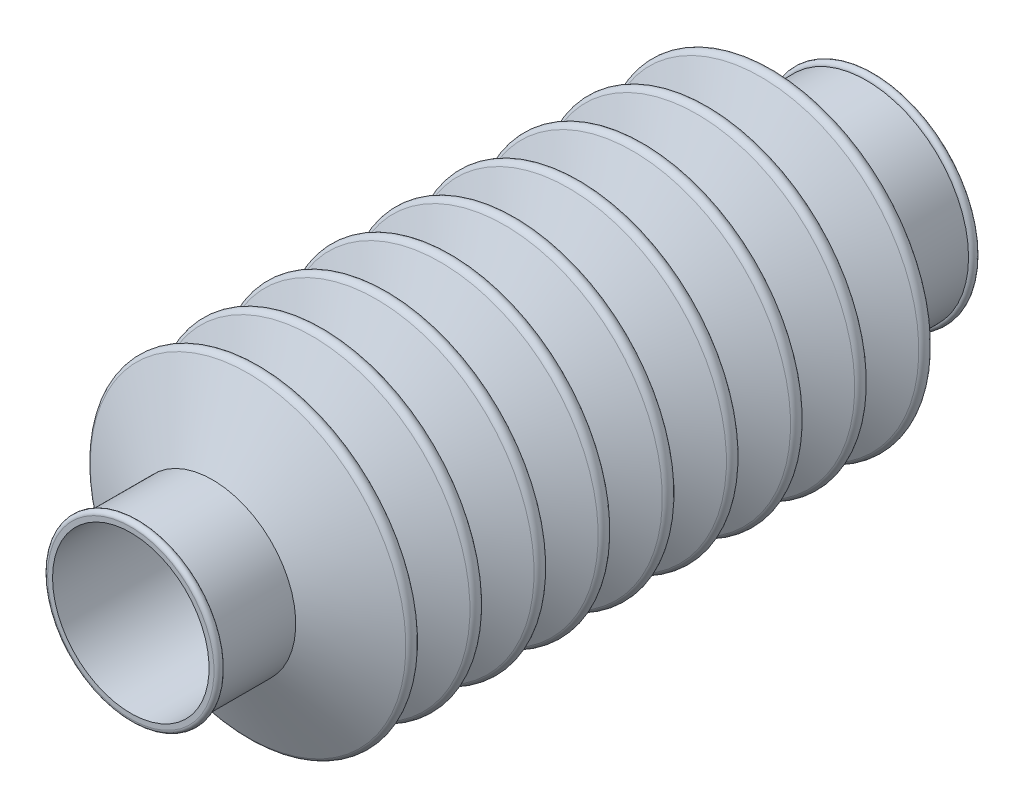
ISO-10303-21;
HEADER;
FILE_DESCRIPTION(('STEP AP214'),'2;1');
FILE_NAME('part.step','',(''),(''),'','','');
FILE_SCHEMA(('AUTOMOTIVE_DESIGN { 1 0 10303 214 1 1 1 1 }'));
ENDSEC;
DATA;
#1=APPLICATION_CONTEXT('core data for automotive mechanical design processes');
#2=APPLICATION_PROTOCOL_DEFINITION('international standard','automotive_design',2000,#1);
#3=PRODUCT_CONTEXT('',#1,'mechanical');
#4=PRODUCT('Part','Part','',(#3));
#5=PRODUCT_RELATED_PRODUCT_CATEGORY('part','',(#4));
#6=PRODUCT_DEFINITION_FORMATION('','',#4);
#7=PRODUCT_DEFINITION_CONTEXT('part definition',#1,'design');
#8=PRODUCT_DEFINITION('design','',#6,#7);
#9=PRODUCT_DEFINITION_SHAPE('','',#8);
#10=(LENGTH_UNIT() NAMED_UNIT(*) SI_UNIT(.MILLI.,.METRE.));
#11=(NAMED_UNIT(*) PLANE_ANGLE_UNIT() SI_UNIT($,.RADIAN.));
#12=(NAMED_UNIT(*) SI_UNIT($,.STERADIAN.) SOLID_ANGLE_UNIT());
#13=UNCERTAINTY_MEASURE_WITH_UNIT(LENGTH_MEASURE(1.E-05),#10,'distance_accuracy_value','');
#14=(GEOMETRIC_REPRESENTATION_CONTEXT(3) GLOBAL_UNCERTAINTY_ASSIGNED_CONTEXT((#13)) GLOBAL_UNIT_ASSIGNED_CONTEXT((#10,
#11,#12)) REPRESENTATION_CONTEXT('',''));
#15=CARTESIAN_POINT('',(0.,0.,0.));
#16=DIRECTION('',(0.,0.,1.));
#17=DIRECTION('',(1.,0.,0.));
#18=AXIS2_PLACEMENT_3D('',#15,#16,#17);
#19=CARTESIAN_POINT('',(0.,0.,-18.));
#20=DIRECTION('',(0.,0.,-1.));
#21=DIRECTION('',(-1.,0.,0.));
#22=AXIS2_PLACEMENT_3D('',#19,#20,#21);
#23=CYLINDRICAL_SURFACE('',#22,15.875);
#24=CARTESIAN_POINT('',(0.,0.,2.84235077182747));
#25=DIRECTION('',(0.,0.,-1.));
#26=DIRECTION('',(-1.,0.,0.));
#27=AXIS2_PLACEMENT_3D('',#24,#25,#26);
#28=CIRCLE('',#27,15.875);
#29=CARTESIAN_POINT('',(-15.875,0.,2.84235077182747));
#30=VERTEX_POINT('',#29);
#31=EDGE_CURVE('E10',#30,#30,#28,.T.);
#32=ORIENTED_EDGE('',*,*,#31,.F.);
#33=EDGE_LOOP('',(#32));
#34=FACE_BOUND('',#33,.T.);
#35=CARTESIAN_POINT('',(0.,0.,-18.));
#36=DIRECTION('',(0.,0.,-1.));
#37=DIRECTION('',(-1.,0.,0.));
#38=AXIS2_PLACEMENT_3D('',#35,#36,#37);
#39=CIRCLE('',#38,15.875);
#40=CARTESIAN_POINT('',(-15.875,0.,-18.));
#41=VERTEX_POINT('',#40);
#42=EDGE_CURVE('E143',#41,#41,#39,.T.);
#43=ORIENTED_EDGE('',*,*,#42,.T.);
#44=EDGE_LOOP('',(#43));
#45=FACE_BOUND('',#44,.T.);
#46=ADVANCED_FACE('F31',(#34,#45),#23,.F.);
#47=CARTESIAN_POINT('',(15.875,0.,2.84235077182746));
#48=DIRECTION('',(0.,0.,1.));
#49=DIRECTION('',(1.,0.,0.));
#50=AXIS2_PLACEMENT_3D('',#47,#48,#49);
#51=PLANE('',#50);
#52=CARTESIAN_POINT('',(0.,0.,2.84235077182746));
#53=DIRECTION('',(0.,0.,-1.));
#54=DIRECTION('',(-1.,0.,0.));
#55=AXIS2_PLACEMENT_3D('',#52,#53,#54);
#56=CIRCLE('',#55,12.7);
#57=CARTESIAN_POINT('',(-12.7,0.,2.84235077182746));
#58=VERTEX_POINT('',#57);
#59=EDGE_CURVE('E37',#58,#58,#56,.T.);
#60=ORIENTED_EDGE('',*,*,#59,.F.);
#61=EDGE_LOOP('',(#60));
#62=FACE_BOUND('',#61,.T.);
#63=ORIENTED_EDGE('',*,*,#31,.T.);
#64=EDGE_LOOP('',(#63));
#65=FACE_BOUND('',#64,.T.);
#66=ADVANCED_FACE('F348',(#62,#65),#51,.F.);
#67=CARTESIAN_POINT('',(0.,0.,-18.));
#68=DIRECTION('',(0.,0.,-1.));
#69=DIRECTION('',(-1.,0.,0.));
#70=AXIS2_PLACEMENT_3D('',#67,#68,#69);
#71=CYLINDRICAL_SURFACE('',#70,12.7);
#72=CARTESIAN_POINT('',(0.,0.,102.624238068493));
#73=DIRECTION('',(0.,0.,-1.));
#74=DIRECTION('',(-1.,0.,0.));
#75=AXIS2_PLACEMENT_3D('',#72,#73,#74);
#76=CIRCLE('',#75,12.7);
#77=CARTESIAN_POINT('',(-12.7,0.,102.624238068493));
#78=VERTEX_POINT('',#77);
#79=EDGE_CURVE('E41',#78,#78,#76,.T.);
#80=ORIENTED_EDGE('',*,*,#79,.F.);
#81=EDGE_LOOP('',(#80));
#82=FACE_BOUND('',#81,.T.);
#83=ORIENTED_EDGE('',*,*,#59,.T.);
#84=EDGE_LOOP('',(#83));
#85=FACE_BOUND('',#84,.T.);
#86=ADVANCED_FACE('F343',(#82,#85),#71,.F.);
#87=CARTESIAN_POINT('',(12.7,0.,102.624238068493));
#88=DIRECTION('',(0.,0.,-1.));
#89=DIRECTION('',(-1.,0.,0.));
#90=AXIS2_PLACEMENT_3D('',#87,#88,#89);
#91=PLANE('',#90);
#92=CARTESIAN_POINT('',(0.,0.,102.624238068493));
#93=DIRECTION('',(0.,0.,-1.));
#94=DIRECTION('',(-1.,0.,0.));
#95=AXIS2_PLACEMENT_3D('',#92,#93,#94);
#96=CIRCLE('',#95,13.5);
#97=CARTESIAN_POINT('',(-13.5,0.,102.624238068493));
#98=VERTEX_POINT('',#97);
#99=EDGE_CURVE('E45',#98,#98,#96,.T.);
#100=ORIENTED_EDGE('',*,*,#99,.F.);
#101=EDGE_LOOP('',(#100));
#102=FACE_BOUND('',#101,.T.);
#103=ORIENTED_EDGE('',*,*,#79,.T.);
#104=EDGE_LOOP('',(#103));
#105=FACE_BOUND('',#104,.T.);
#106=ADVANCED_FACE('F337',(#102,#105),#91,.F.);
#107=CARTESIAN_POINT('',(0.,0.,101.994238068493));
#108=DIRECTION('',(0.,0.,-1.));
#109=DIRECTION('',(-1.,0.,0.));
#110=AXIS2_PLACEMENT_3D('',#107,#108,#109);
#111=TOROIDAL_SURFACE('',#110,13.5,0.629999999999992);
#112=CARTESIAN_POINT('',(0.,0.,101.364238068493));
#113=DIRECTION('',(0.,0.,-1.));
#114=DIRECTION('',(-1.,0.,0.));
#115=AXIS2_PLACEMENT_3D('',#112,#113,#114);
#116=CIRCLE('',#115,13.5);
#117=CARTESIAN_POINT('',(-13.5,0.,101.364238068493));
#118=VERTEX_POINT('',#117);
#119=EDGE_CURVE('E50',#118,#118,#116,.T.);
#120=ORIENTED_EDGE('',*,*,#119,.F.);
#121=EDGE_LOOP('',(#120));
#122=FACE_BOUND('',#121,.T.);
#123=ORIENTED_EDGE('',*,*,#99,.T.);
#124=EDGE_LOOP('',(#123));
#125=FACE_BOUND('',#124,.T.);
#126=ADVANCED_FACE('F331',(#122,#125),#111,.T.);
#127=CARTESIAN_POINT('',(0.,0.,-18.));
#128=DIRECTION('',(0.,0.,-1.));
#129=DIRECTION('',(-1.,0.,0.));
#130=AXIS2_PLACEMENT_3D('',#127,#128,#129);
#131=CYLINDRICAL_SURFACE('',#130,13.5);
#132=CARTESIAN_POINT('',(0.,0.,89.3642380684931));
#133=DIRECTION('',(0.,0.,-1.));
#134=DIRECTION('',(-1.,0.,0.));
#135=AXIS2_PLACEMENT_3D('',#132,#133,#134);
#136=CIRCLE('',#135,13.5);
#137=CARTESIAN_POINT('',(-13.5,0.,89.3642380684931));
#138=VERTEX_POINT('',#137);
#139=EDGE_CURVE('E53',#138,#138,#136,.T.);
#140=ORIENTED_EDGE('',*,*,#139,.F.);
#141=EDGE_LOOP('',(#140));
#142=FACE_BOUND('',#141,.T.);
#143=ORIENTED_EDGE('',*,*,#119,.T.);
#144=EDGE_LOOP('',(#143));
#145=FACE_BOUND('',#144,.T.);
#146=ADVANCED_FACE('F325',(#142,#145),#131,.T.);
#147=CARTESIAN_POINT('',(0.,0.,87.9013978679723));
#148=DIRECTION('',(0.,0.,-1.));
#149=DIRECTION('',(-1.,0.,0.));
#150=AXIS2_PLACEMENT_3D('',#147,#148,#149);
#151=CONICAL_SURFACE('',#150,16.5723251180486,1.12642268980355);
#152=CARTESIAN_POINT('',(0.,0.,83.6024735283227));
#153=DIRECTION('',(0.,0.,-1.));
#154=DIRECTION('',(-1.,0.,0.));
#155=AXIS2_PLACEMENT_3D('',#152,#153,#154);
#156=CIRCLE('',#155,25.6011262301547);
#157=CARTESIAN_POINT('',(-25.6011262301547,0.,83.6024735283227));
#158=VERTEX_POINT('',#157);
#159=EDGE_CURVE('E56',#158,#158,#156,.T.);
#160=ORIENTED_EDGE('',*,*,#159,.F.);
#161=EDGE_LOOP('',(#160));
#162=FACE_BOUND('',#161,.T.);
#163=ORIENTED_EDGE('',*,*,#139,.T.);
#164=EDGE_LOOP('',(#163));
#165=FACE_BOUND('',#164,.T.);
#166=ADVANCED_FACE('F319',(#162,#165),#151,.T.);
#167=CARTESIAN_POINT('',(0.,0.,82.6995934171121));
#168=DIRECTION('',(0.,0.,-1.));
#169=DIRECTION('',(-1.,0.,0.));
#170=AXIS2_PLACEMENT_3D('',#167,#168,#169);
#171=TOROIDAL_SURFACE('',#170,25.1712337961898,1.);
#172=CARTESIAN_POINT('',(0.,0.,81.7967133059015));
#173=DIRECTION('',(0.,0.,-1.));
#174=DIRECTION('',(-1.,0.,0.));
#175=AXIS2_PLACEMENT_3D('',#172,#173,#174);
#176=CIRCLE('',#175,25.6011262301547);
#177=CARTESIAN_POINT('',(-25.6011262301547,0.,81.7967133059015));
#178=VERTEX_POINT('',#177);
#179=EDGE_CURVE('E59',#178,#178,#176,.T.);
#180=ORIENTED_EDGE('',*,*,#179,.F.);
#181=EDGE_LOOP('',(#180));
#182=FACE_BOUND('',#181,.T.);
#183=ORIENTED_EDGE('',*,*,#159,.T.);
#184=EDGE_LOOP('',(#183));
#185=FACE_BOUND('',#184,.T.);
#186=ADVANCED_FACE('F313',(#182,#185),#171,.T.);
#187=CARTESIAN_POINT('',(0.,0.,81.7967133059015));
#188=DIRECTION('',(0.,0.,1.));
#189=DIRECTION('',(1.,0.,0.));
#190=AXIS2_PLACEMENT_3D('',#187,#188,#189);
#191=CONICAL_SURFACE('',#190,25.6011262301547,1.12642268980355);
#192=CARTESIAN_POINT('',(0.,0.,77.497788966252));
#193=DIRECTION('',(0.,0.,-1.));
#194=DIRECTION('',(-1.,0.,0.));
#195=AXIS2_PLACEMENT_3D('',#192,#193,#194);
#196=CIRCLE('',#195,16.5723251180486);
#197=CARTESIAN_POINT('',(-16.5723251180486,0.,77.497788966252));
#198=VERTEX_POINT('',#197);
#199=EDGE_CURVE('E62',#198,#198,#196,.T.);
#200=ORIENTED_EDGE('',*,*,#199,.F.);
#201=EDGE_LOOP('',(#200));
#202=FACE_BOUND('',#201,.T.);
#203=ORIENTED_EDGE('',*,*,#179,.T.);
#204=EDGE_LOOP('',(#203));
#205=FACE_BOUND('',#204,.T.);
#206=ADVANCED_FACE('F307',(#202,#205),#191,.T.);
#207=CARTESIAN_POINT('',(0.,0.,77.497788966252));
#208=DIRECTION('',(0.,0.,-1.));
#209=DIRECTION('',(-1.,0.,0.));
#210=AXIS2_PLACEMENT_3D('',#207,#208,#209);
#211=CONICAL_SURFACE('',#210,16.5723251180486,1.12642268980355);
#212=CARTESIAN_POINT('',(0.,0.,73.1988646266024));
#213=DIRECTION('',(0.,0.,-1.));
#214=DIRECTION('',(-1.,0.,0.));
#215=AXIS2_PLACEMENT_3D('',#212,#213,#214);
#216=CIRCLE('',#215,25.6011262301547);
#217=CARTESIAN_POINT('',(-25.6011262301547,0.,73.1988646266024));
#218=VERTEX_POINT('',#217);
#219=EDGE_CURVE('E65',#218,#218,#216,.T.);
#220=ORIENTED_EDGE('',*,*,#219,.F.);
#221=EDGE_LOOP('',(#220));
#222=FACE_BOUND('',#221,.T.);
#223=ORIENTED_EDGE('',*,*,#199,.T.);
#224=EDGE_LOOP('',(#223));
#225=FACE_BOUND('',#224,.T.);
#226=ADVANCED_FACE('F301',(#222,#225),#211,.T.);
#227=CARTESIAN_POINT('',(0.,0.,72.2959845153918));
#228=DIRECTION('',(0.,0.,-1.));
#229=DIRECTION('',(-1.,0.,0.));
#230=AXIS2_PLACEMENT_3D('',#227,#228,#229);
#231=TOROIDAL_SURFACE('',#230,25.1712337961898,1.);
#232=CARTESIAN_POINT('',(0.,0.,71.3931044041812));
#233=DIRECTION('',(0.,0.,-1.));
#234=DIRECTION('',(-1.,0.,0.));
#235=AXIS2_PLACEMENT_3D('',#232,#233,#234);
#236=CIRCLE('',#235,25.6011262301547);
#237=CARTESIAN_POINT('',(-25.6011262301547,0.,71.3931044041812));
#238=VERTEX_POINT('',#237);
#239=EDGE_CURVE('E68',#238,#238,#236,.T.);
#240=ORIENTED_EDGE('',*,*,#239,.F.);
#241=EDGE_LOOP('',(#240));
#242=FACE_BOUND('',#241,.T.);
#243=ORIENTED_EDGE('',*,*,#219,.T.);
#244=EDGE_LOOP('',(#243));
#245=FACE_BOUND('',#244,.T.);
#246=ADVANCED_FACE('F295',(#242,#245),#231,.T.);
#247=CARTESIAN_POINT('',(0.,0.,71.3931044041812));
#248=DIRECTION('',(0.,0.,1.));
#249=DIRECTION('',(1.,0.,0.));
#250=AXIS2_PLACEMENT_3D('',#247,#248,#249);
#251=CONICAL_SURFACE('',#250,25.6011262301547,1.12642268980355);
#252=CARTESIAN_POINT('',(0.,0.,67.0941800645317));
#253=DIRECTION('',(0.,0.,-1.));
#254=DIRECTION('',(-1.,0.,0.));
#255=AXIS2_PLACEMENT_3D('',#252,#253,#254);
#256=CIRCLE('',#255,16.5723251180486);
#257=CARTESIAN_POINT('',(-16.5723251180486,0.,67.0941800645317));
#258=VERTEX_POINT('',#257);
#259=EDGE_CURVE('E71',#258,#258,#256,.T.);
#260=ORIENTED_EDGE('',*,*,#259,.F.);
#261=EDGE_LOOP('',(#260));
#262=FACE_BOUND('',#261,.T.);
#263=ORIENTED_EDGE('',*,*,#239,.T.);
#264=EDGE_LOOP('',(#263));
#265=FACE_BOUND('',#264,.T.);
#266=ADVANCED_FACE('F289',(#262,#265),#251,.T.);
#267=CARTESIAN_POINT('',(0.,0.,67.0941800645317));
#268=DIRECTION('',(0.,0.,-1.));
#269=DIRECTION('',(-1.,0.,0.));
#270=AXIS2_PLACEMENT_3D('',#267,#268,#269);
#271=CONICAL_SURFACE('',#270,16.5723251180486,1.12642268980355);
#272=CARTESIAN_POINT('',(0.,0.,62.7952557248821));
#273=DIRECTION('',(0.,0.,-1.));
#274=DIRECTION('',(-1.,0.,0.));
#275=AXIS2_PLACEMENT_3D('',#272,#273,#274);
#276=CIRCLE('',#275,25.6011262301547);
#277=CARTESIAN_POINT('',(-25.6011262301547,0.,62.7952557248821));
#278=VERTEX_POINT('',#277);
#279=EDGE_CURVE('E74',#278,#278,#276,.T.);
#280=ORIENTED_EDGE('',*,*,#279,.F.);
#281=EDGE_LOOP('',(#280));
#282=FACE_BOUND('',#281,.T.);
#283=ORIENTED_EDGE('',*,*,#259,.T.);
#284=EDGE_LOOP('',(#283));
#285=FACE_BOUND('',#284,.T.);
#286=ADVANCED_FACE('F283',(#282,#285),#271,.T.);
#287=CARTESIAN_POINT('',(0.,0.,61.8923756136715));
#288=DIRECTION('',(0.,0.,-1.));
#289=DIRECTION('',(-1.,0.,0.));
#290=AXIS2_PLACEMENT_3D('',#287,#288,#289);
#291=TOROIDAL_SURFACE('',#290,25.1712337961898,1.);
#292=CARTESIAN_POINT('',(0.,0.,60.9894955024609));
#293=DIRECTION('',(0.,0.,-1.));
#294=DIRECTION('',(-1.,0.,0.));
#295=AXIS2_PLACEMENT_3D('',#292,#293,#294);
#296=CIRCLE('',#295,25.6011262301547);
#297=CARTESIAN_POINT('',(-25.6011262301547,0.,60.9894955024609));
#298=VERTEX_POINT('',#297);
#299=EDGE_CURVE('E77',#298,#298,#296,.T.);
#300=ORIENTED_EDGE('',*,*,#299,.F.);
#301=EDGE_LOOP('',(#300));
#302=FACE_BOUND('',#301,.T.);
#303=ORIENTED_EDGE('',*,*,#279,.T.);
#304=EDGE_LOOP('',(#303));
#305=FACE_BOUND('',#304,.T.);
#306=ADVANCED_FACE('F277',(#302,#305),#291,.T.);
#307=CARTESIAN_POINT('',(0.,0.,60.9894955024609));
#308=DIRECTION('',(0.,0.,1.));
#309=DIRECTION('',(1.,0.,0.));
#310=AXIS2_PLACEMENT_3D('',#307,#308,#309);
#311=CONICAL_SURFACE('',#310,25.6011262301547,1.12642268980355);
#312=CARTESIAN_POINT('',(0.,0.,56.6905711628113));
#313=DIRECTION('',(0.,0.,-1.));
#314=DIRECTION('',(-1.,0.,0.));
#315=AXIS2_PLACEMENT_3D('',#312,#313,#314);
#316=CIRCLE('',#315,16.5723251180486);
#317=CARTESIAN_POINT('',(-16.5723251180486,0.,56.6905711628113));
#318=VERTEX_POINT('',#317);
#319=EDGE_CURVE('E80',#318,#318,#316,.T.);
#320=ORIENTED_EDGE('',*,*,#319,.F.);
#321=EDGE_LOOP('',(#320));
#322=FACE_BOUND('',#321,.T.);
#323=ORIENTED_EDGE('',*,*,#299,.T.);
#324=EDGE_LOOP('',(#323));
#325=FACE_BOUND('',#324,.T.);
#326=ADVANCED_FACE('F271',(#322,#325),#311,.T.);
#327=CARTESIAN_POINT('',(0.,0.,56.6905711628113));
#328=DIRECTION('',(0.,0.,-1.));
#329=DIRECTION('',(-1.,0.,0.));
#330=AXIS2_PLACEMENT_3D('',#327,#328,#329);
#331=CONICAL_SURFACE('',#330,16.5723251180486,1.12642268980355);
#332=CARTESIAN_POINT('',(0.,0.,52.3916468231618));
#333=DIRECTION('',(0.,0.,-1.));
#334=DIRECTION('',(-1.,0.,0.));
#335=AXIS2_PLACEMENT_3D('',#332,#333,#334);
#336=CIRCLE('',#335,25.6011262301547);
#337=CARTESIAN_POINT('',(-25.6011262301547,0.,52.3916468231618));
#338=VERTEX_POINT('',#337);
#339=EDGE_CURVE('E83',#338,#338,#336,.T.);
#340=ORIENTED_EDGE('',*,*,#339,.F.);
#341=EDGE_LOOP('',(#340));
#342=FACE_BOUND('',#341,.T.);
#343=ORIENTED_EDGE('',*,*,#319,.T.);
#344=EDGE_LOOP('',(#343));
#345=FACE_BOUND('',#344,.T.);
#346=ADVANCED_FACE('F265',(#342,#345),#331,.T.);
#347=CARTESIAN_POINT('',(0.,0.,51.4887667119512));
#348=DIRECTION('',(0.,0.,-1.));
#349=DIRECTION('',(-1.,0.,0.));
#350=AXIS2_PLACEMENT_3D('',#347,#348,#349);
#351=TOROIDAL_SURFACE('',#350,25.1712337961898,1.);
#352=CARTESIAN_POINT('',(0.,0.,50.5858866007406));
#353=DIRECTION('',(0.,0.,-1.));
#354=DIRECTION('',(-1.,0.,0.));
#355=AXIS2_PLACEMENT_3D('',#352,#353,#354);
#356=CIRCLE('',#355,25.6011262301547);
#357=CARTESIAN_POINT('',(-25.6011262301547,0.,50.5858866007406));
#358=VERTEX_POINT('',#357);
#359=EDGE_CURVE('E86',#358,#358,#356,.T.);
#360=ORIENTED_EDGE('',*,*,#359,.F.);
#361=EDGE_LOOP('',(#360));
#362=FACE_BOUND('',#361,.T.);
#363=ORIENTED_EDGE('',*,*,#339,.T.);
#364=EDGE_LOOP('',(#363));
#365=FACE_BOUND('',#364,.T.);
#366=ADVANCED_FACE('F259',(#362,#365),#351,.T.);
#367=CARTESIAN_POINT('',(0.,0.,50.5858866007406));
#368=DIRECTION('',(0.,0.,1.));
#369=DIRECTION('',(1.,0.,0.));
#370=AXIS2_PLACEMENT_3D('',#367,#368,#369);
#371=CONICAL_SURFACE('',#370,25.6011262301547,1.12642268980355);
#372=CARTESIAN_POINT('',(0.,0.,46.286962261091));
#373=DIRECTION('',(0.,0.,-1.));
#374=DIRECTION('',(-1.,0.,0.));
#375=AXIS2_PLACEMENT_3D('',#372,#373,#374);
#376=CIRCLE('',#375,16.5723251180486);
#377=CARTESIAN_POINT('',(-16.5723251180486,0.,46.286962261091));
#378=VERTEX_POINT('',#377);
#379=EDGE_CURVE('E89',#378,#378,#376,.T.);
#380=ORIENTED_EDGE('',*,*,#379,.F.);
#381=EDGE_LOOP('',(#380));
#382=FACE_BOUND('',#381,.T.);
#383=ORIENTED_EDGE('',*,*,#359,.T.);
#384=EDGE_LOOP('',(#383));
#385=FACE_BOUND('',#384,.T.);
#386=ADVANCED_FACE('F253',(#382,#385),#371,.T.);
#387=CARTESIAN_POINT('',(0.,0.,46.286962261091));
#388=DIRECTION('',(0.,0.,-1.));
#389=DIRECTION('',(-1.,0.,0.));
#390=AXIS2_PLACEMENT_3D('',#387,#388,#389);
#391=CONICAL_SURFACE('',#390,16.5723251180486,1.12642268980355);
#392=CARTESIAN_POINT('',(0.,0.,41.9880379214415));
#393=DIRECTION('',(0.,0.,-1.));
#394=DIRECTION('',(-1.,0.,0.));
#395=AXIS2_PLACEMENT_3D('',#392,#393,#394);
#396=CIRCLE('',#395,25.6011262301547);
#397=CARTESIAN_POINT('',(-25.6011262301547,0.,41.9880379214415));
#398=VERTEX_POINT('',#397);
#399=EDGE_CURVE('E92',#398,#398,#396,.T.);
#400=ORIENTED_EDGE('',*,*,#399,.F.);
#401=EDGE_LOOP('',(#400));
#402=FACE_BOUND('',#401,.T.);
#403=ORIENTED_EDGE('',*,*,#379,.T.);
#404=EDGE_LOOP('',(#403));
#405=FACE_BOUND('',#404,.T.);
#406=ADVANCED_FACE('F247',(#402,#405),#391,.T.);
#407=CARTESIAN_POINT('',(0.,0.,41.0851578102309));
#408=DIRECTION('',(0.,0.,-1.));
#409=DIRECTION('',(-1.,0.,0.));
#410=AXIS2_PLACEMENT_3D('',#407,#408,#409);
#411=TOROIDAL_SURFACE('',#410,25.1712337961898,1.);
#412=CARTESIAN_POINT('',(0.,0.,40.1822776990203));
#413=DIRECTION('',(0.,0.,-1.));
#414=DIRECTION('',(-1.,0.,0.));
#415=AXIS2_PLACEMENT_3D('',#412,#413,#414);
#416=CIRCLE('',#415,25.6011262301547);
#417=CARTESIAN_POINT('',(-25.6011262301547,0.,40.1822776990203));
#418=VERTEX_POINT('',#417);
#419=EDGE_CURVE('E95',#418,#418,#416,.T.);
#420=ORIENTED_EDGE('',*,*,#419,.F.);
#421=EDGE_LOOP('',(#420));
#422=FACE_BOUND('',#421,.T.);
#423=ORIENTED_EDGE('',*,*,#399,.T.);
#424=EDGE_LOOP('',(#423));
#425=FACE_BOUND('',#424,.T.);
#426=ADVANCED_FACE('F241',(#422,#425),#411,.T.);
#427=CARTESIAN_POINT('',(0.,0.,40.1822776990203));
#428=DIRECTION('',(0.,0.,1.));
#429=DIRECTION('',(1.,0.,0.));
#430=AXIS2_PLACEMENT_3D('',#427,#428,#429);
#431=CONICAL_SURFACE('',#430,25.6011262301547,1.12642268980355);
#432=CARTESIAN_POINT('',(0.,0.,35.8833533593707));
#433=DIRECTION('',(0.,0.,-1.));
#434=DIRECTION('',(-1.,0.,0.));
#435=AXIS2_PLACEMENT_3D('',#432,#433,#434);
#436=CIRCLE('',#435,16.5723251180486);
#437=CARTESIAN_POINT('',(-16.5723251180486,0.,35.8833533593707));
#438=VERTEX_POINT('',#437);
#439=EDGE_CURVE('E98',#438,#438,#436,.T.);
#440=ORIENTED_EDGE('',*,*,#439,.F.);
#441=EDGE_LOOP('',(#440));
#442=FACE_BOUND('',#441,.T.);
#443=ORIENTED_EDGE('',*,*,#419,.T.);
#444=EDGE_LOOP('',(#443));
#445=FACE_BOUND('',#444,.T.);
#446=ADVANCED_FACE('F235',(#442,#445),#431,.T.);
#447=CARTESIAN_POINT('',(0.,0.,35.8833533593707));
#448=DIRECTION('',(0.,0.,-1.));
#449=DIRECTION('',(-1.,0.,0.));
#450=AXIS2_PLACEMENT_3D('',#447,#448,#449);
#451=CONICAL_SURFACE('',#450,16.5723251180486,1.12642268980355);
#452=CARTESIAN_POINT('',(0.,0.,31.5844290197212));
#453=DIRECTION('',(0.,0.,-1.));
#454=DIRECTION('',(-1.,0.,0.));
#455=AXIS2_PLACEMENT_3D('',#452,#453,#454);
#456=CIRCLE('',#455,25.6011262301547);
#457=CARTESIAN_POINT('',(-25.6011262301547,0.,31.5844290197212));
#458=VERTEX_POINT('',#457);
#459=EDGE_CURVE('E101',#458,#458,#456,.T.);
#460=ORIENTED_EDGE('',*,*,#459,.F.);
#461=EDGE_LOOP('',(#460));
#462=FACE_BOUND('',#461,.T.);
#463=ORIENTED_EDGE('',*,*,#439,.T.);
#464=EDGE_LOOP('',(#463));
#465=FACE_BOUND('',#464,.T.);
#466=ADVANCED_FACE('F229',(#462,#465),#451,.T.);
#467=CARTESIAN_POINT('',(0.,0.,30.6815489085106));
#468=DIRECTION('',(0.,0.,-1.));
#469=DIRECTION('',(-1.,0.,0.));
#470=AXIS2_PLACEMENT_3D('',#467,#468,#469);
#471=TOROIDAL_SURFACE('',#470,25.1712337961898,1.);
#472=CARTESIAN_POINT('',(0.,0.,29.7786687973));
#473=DIRECTION('',(0.,0.,-1.));
#474=DIRECTION('',(-1.,0.,0.));
#475=AXIS2_PLACEMENT_3D('',#472,#473,#474);
#476=CIRCLE('',#475,25.6011262301547);
#477=CARTESIAN_POINT('',(-25.6011262301547,0.,29.7786687973));
#478=VERTEX_POINT('',#477);
#479=EDGE_CURVE('E104',#478,#478,#476,.T.);
#480=ORIENTED_EDGE('',*,*,#479,.F.);
#481=EDGE_LOOP('',(#480));
#482=FACE_BOUND('',#481,.T.);
#483=ORIENTED_EDGE('',*,*,#459,.T.);
#484=EDGE_LOOP('',(#483));
#485=FACE_BOUND('',#484,.T.);
#486=ADVANCED_FACE('F223',(#482,#485),#471,.T.);
#487=CARTESIAN_POINT('',(0.,0.,29.7786687973));
#488=DIRECTION('',(0.,0.,1.));
#489=DIRECTION('',(1.,0.,0.));
#490=AXIS2_PLACEMENT_3D('',#487,#488,#489);
#491=CONICAL_SURFACE('',#490,25.6011262301547,1.12642268980355);
#492=CARTESIAN_POINT('',(0.,0.,25.4797444576504));
#493=DIRECTION('',(0.,0.,-1.));
#494=DIRECTION('',(-1.,0.,0.));
#495=AXIS2_PLACEMENT_3D('',#492,#493,#494);
#496=CIRCLE('',#495,16.5723251180486);
#497=CARTESIAN_POINT('',(-16.5723251180486,0.,25.4797444576504));
#498=VERTEX_POINT('',#497);
#499=EDGE_CURVE('E107',#498,#498,#496,.T.);
#500=ORIENTED_EDGE('',*,*,#499,.F.);
#501=EDGE_LOOP('',(#500));
#502=FACE_BOUND('',#501,.T.);
#503=ORIENTED_EDGE('',*,*,#479,.T.);
#504=EDGE_LOOP('',(#503));
#505=FACE_BOUND('',#504,.T.);
#506=ADVANCED_FACE('F217',(#502,#505),#491,.T.);
#507=CARTESIAN_POINT('',(0.,0.,25.4797444576504));
#508=DIRECTION('',(0.,0.,-1.));
#509=DIRECTION('',(-1.,0.,0.));
#510=AXIS2_PLACEMENT_3D('',#507,#508,#509);
#511=CONICAL_SURFACE('',#510,16.5723251180486,1.12642268980355);
#512=CARTESIAN_POINT('',(0.,0.,21.1808201180009));
#513=DIRECTION('',(0.,0.,-1.));
#514=DIRECTION('',(-1.,0.,0.));
#515=AXIS2_PLACEMENT_3D('',#512,#513,#514);
#516=CIRCLE('',#515,25.6011262301547);
#517=CARTESIAN_POINT('',(-25.6011262301547,0.,21.1808201180009));
#518=VERTEX_POINT('',#517);
#519=EDGE_CURVE('E110',#518,#518,#516,.T.);
#520=ORIENTED_EDGE('',*,*,#519,.F.);
#521=EDGE_LOOP('',(#520));
#522=FACE_BOUND('',#521,.T.);
#523=ORIENTED_EDGE('',*,*,#499,.T.);
#524=EDGE_LOOP('',(#523));
#525=FACE_BOUND('',#524,.T.);
#526=ADVANCED_FACE('F211',(#522,#525),#511,.T.);
#527=CARTESIAN_POINT('',(0.,0.,20.2779400067903));
#528=DIRECTION('',(0.,0.,-1.));
#529=DIRECTION('',(-1.,0.,0.));
#530=AXIS2_PLACEMENT_3D('',#527,#528,#529);
#531=TOROIDAL_SURFACE('',#530,25.1712337961898,1.);
#532=CARTESIAN_POINT('',(0.,0.,19.3750598955797));
#533=DIRECTION('',(0.,0.,-1.));
#534=DIRECTION('',(-1.,0.,0.));
#535=AXIS2_PLACEMENT_3D('',#532,#533,#534);
#536=CIRCLE('',#535,25.6011262301547);
#537=CARTESIAN_POINT('',(-25.6011262301547,0.,19.3750598955797));
#538=VERTEX_POINT('',#537);
#539=EDGE_CURVE('E113',#538,#538,#536,.T.);
#540=ORIENTED_EDGE('',*,*,#539,.F.);
#541=EDGE_LOOP('',(#540));
#542=FACE_BOUND('',#541,.T.);
#543=ORIENTED_EDGE('',*,*,#519,.T.);
#544=EDGE_LOOP('',(#543));
#545=FACE_BOUND('',#544,.T.);
#546=ADVANCED_FACE('F205',(#542,#545),#531,.T.);
#547=CARTESIAN_POINT('',(0.,0.,19.3750598955797));
#548=DIRECTION('',(0.,0.,1.));
#549=DIRECTION('',(1.,0.,0.));
#550=AXIS2_PLACEMENT_3D('',#547,#548,#549);
#551=CONICAL_SURFACE('',#550,25.6011262301547,1.12642268980355);
#552=CARTESIAN_POINT('',(0.,0.,15.0761355559301));
#553=DIRECTION('',(0.,0.,-1.));
#554=DIRECTION('',(-1.,0.,0.));
#555=AXIS2_PLACEMENT_3D('',#552,#553,#554);
#556=CIRCLE('',#555,16.5723251180486);
#557=CARTESIAN_POINT('',(-16.5723251180486,0.,15.0761355559301));
#558=VERTEX_POINT('',#557);
#559=EDGE_CURVE('E116',#558,#558,#556,.T.);
#560=ORIENTED_EDGE('',*,*,#559,.F.);
#561=EDGE_LOOP('',(#560));
#562=FACE_BOUND('',#561,.T.);
#563=ORIENTED_EDGE('',*,*,#539,.T.);
#564=EDGE_LOOP('',(#563));
#565=FACE_BOUND('',#564,.T.);
#566=ADVANCED_FACE('F199',(#562,#565),#551,.T.);
#567=CARTESIAN_POINT('',(0.,0.,15.0761355559301));
#568=DIRECTION('',(0.,0.,-1.));
#569=DIRECTION('',(-1.,0.,0.));
#570=AXIS2_PLACEMENT_3D('',#567,#568,#569);
#571=CONICAL_SURFACE('',#570,16.5723251180486,1.12642268980355);
#572=CARTESIAN_POINT('',(0.,0.,10.7772112162806));
#573=DIRECTION('',(0.,0.,-1.));
#574=DIRECTION('',(-1.,0.,0.));
#575=AXIS2_PLACEMENT_3D('',#572,#573,#574);
#576=CIRCLE('',#575,25.6011262301547);
#577=CARTESIAN_POINT('',(-25.6011262301547,0.,10.7772112162806));
#578=VERTEX_POINT('',#577);
#579=EDGE_CURVE('E119',#578,#578,#576,.T.);
#580=ORIENTED_EDGE('',*,*,#579,.F.);
#581=EDGE_LOOP('',(#580));
#582=FACE_BOUND('',#581,.T.);
#583=ORIENTED_EDGE('',*,*,#559,.T.);
#584=EDGE_LOOP('',(#583));
#585=FACE_BOUND('',#584,.T.);
#586=ADVANCED_FACE('F193',(#582,#585),#571,.T.);
#587=CARTESIAN_POINT('',(0.,0.,9.87433110506998));
#588=DIRECTION('',(0.,0.,-1.));
#589=DIRECTION('',(-1.,0.,0.));
#590=AXIS2_PLACEMENT_3D('',#587,#588,#589);
#591=TOROIDAL_SURFACE('',#590,25.1712337961898,1.);
#592=CARTESIAN_POINT('',(0.,0.,8.97145099385937));
#593=DIRECTION('',(0.,0.,-1.));
#594=DIRECTION('',(-1.,0.,0.));
#595=AXIS2_PLACEMENT_3D('',#592,#593,#594);
#596=CIRCLE('',#595,25.6011262301547);
#597=CARTESIAN_POINT('',(-25.6011262301547,0.,8.97145099385937));
#598=VERTEX_POINT('',#597);
#599=EDGE_CURVE('E122',#598,#598,#596,.T.);
#600=ORIENTED_EDGE('',*,*,#599,.F.);
#601=EDGE_LOOP('',(#600));
#602=FACE_BOUND('',#601,.T.);
#603=ORIENTED_EDGE('',*,*,#579,.T.);
#604=EDGE_LOOP('',(#603));
#605=FACE_BOUND('',#604,.T.);
#606=ADVANCED_FACE('F187',(#602,#605),#591,.T.);
#607=CARTESIAN_POINT('',(0.,0.,8.97145099385937));
#608=DIRECTION('',(0.,0.,1.));
#609=DIRECTION('',(1.,0.,0.));
#610=AXIS2_PLACEMENT_3D('',#607,#608,#609);
#611=CONICAL_SURFACE('',#610,25.6011262301547,1.12642268980355);
#612=CARTESIAN_POINT('',(0.,0.,4.67252665420983));
#613=DIRECTION('',(0.,0.,-1.));
#614=DIRECTION('',(-1.,0.,0.));
#615=AXIS2_PLACEMENT_3D('',#612,#613,#614);
#616=CIRCLE('',#615,16.5723251180486);
#617=CARTESIAN_POINT('',(-16.5723251180486,0.,4.67252665420983));
#618=VERTEX_POINT('',#617);
#619=EDGE_CURVE('E125',#618,#618,#616,.T.);
#620=ORIENTED_EDGE('',*,*,#619,.F.);
#621=EDGE_LOOP('',(#620));
#622=FACE_BOUND('',#621,.T.);
#623=ORIENTED_EDGE('',*,*,#599,.T.);
#624=EDGE_LOOP('',(#623));
#625=FACE_BOUND('',#624,.T.);
#626=ADVANCED_FACE('F181',(#622,#625),#611,.T.);
#627=CARTESIAN_POINT('',(0.,0.,4.67252665420983));
#628=DIRECTION('',(0.,0.,-1.));
#629=DIRECTION('',(-1.,0.,0.));
#630=AXIS2_PLACEMENT_3D('',#627,#628,#629);
#631=CONICAL_SURFACE('',#630,16.5723251180486,1.12642268980355);
#632=CARTESIAN_POINT('',(0.,0.,0.373602314560281));
#633=DIRECTION('',(0.,0.,-1.));
#634=DIRECTION('',(-1.,0.,0.));
#635=AXIS2_PLACEMENT_3D('',#632,#633,#634);
#636=CIRCLE('',#635,25.6011262301547);
#637=CARTESIAN_POINT('',(-25.6011262301547,0.,0.373602314560282));
#638=VERTEX_POINT('',#637);
#639=EDGE_CURVE('E128',#638,#638,#636,.T.);
#640=ORIENTED_EDGE('',*,*,#639,.F.);
#641=EDGE_LOOP('',(#640));
#642=FACE_BOUND('',#641,.T.);
#643=ORIENTED_EDGE('',*,*,#619,.T.);
#644=EDGE_LOOP('',(#643));
#645=FACE_BOUND('',#644,.T.);
#646=ADVANCED_FACE('F175',(#642,#645),#631,.T.);
#647=CARTESIAN_POINT('',(0.,0.,-0.52927779665033));
#648=DIRECTION('',(0.,0.,-1.));
#649=DIRECTION('',(-1.,0.,0.));
#650=AXIS2_PLACEMENT_3D('',#647,#648,#649);
#651=TOROIDAL_SURFACE('',#650,25.1712337961898,1.);
#652=CARTESIAN_POINT('',(0.,0.,-1.43215790786094));
#653=DIRECTION('',(0.,0.,-1.));
#654=DIRECTION('',(-1.,0.,0.));
#655=AXIS2_PLACEMENT_3D('',#652,#653,#654);
#656=CIRCLE('',#655,25.6011262301547);
#657=CARTESIAN_POINT('',(-25.6011262301547,0.,-1.43215790786094));
#658=VERTEX_POINT('',#657);
#659=EDGE_CURVE('E131',#658,#658,#656,.T.);
#660=ORIENTED_EDGE('',*,*,#659,.F.);
#661=EDGE_LOOP('',(#660));
#662=FACE_BOUND('',#661,.T.);
#663=ORIENTED_EDGE('',*,*,#639,.T.);
#664=EDGE_LOOP('',(#663));
#665=FACE_BOUND('',#664,.T.);
#666=ADVANCED_FACE('F169',(#662,#665),#651,.T.);
#667=CARTESIAN_POINT('',(0.,0.,-1.43215790786094));
#668=DIRECTION('',(0.,0.,1.));
#669=DIRECTION('',(1.,0.,0.));
#670=AXIS2_PLACEMENT_3D('',#667,#668,#669);
#671=CONICAL_SURFACE('',#670,25.6011262301547,1.12642268980355);
#672=CARTESIAN_POINT('',(0.,0.,-5.73108224751049));
#673=DIRECTION('',(0.,0.,-1.));
#674=DIRECTION('',(-1.,0.,0.));
#675=AXIS2_PLACEMENT_3D('',#672,#673,#674);
#676=CIRCLE('',#675,16.5723251180486);
#677=CARTESIAN_POINT('',(-16.5723251180486,0.,-5.73108224751049));
#678=VERTEX_POINT('',#677);
#679=EDGE_CURVE('E134',#678,#678,#676,.T.);
#680=ORIENTED_EDGE('',*,*,#679,.F.);
#681=EDGE_LOOP('',(#680));
#682=FACE_BOUND('',#681,.T.);
#683=ORIENTED_EDGE('',*,*,#659,.T.);
#684=EDGE_LOOP('',(#683));
#685=FACE_BOUND('',#684,.T.);
#686=ADVANCED_FACE('F163',(#682,#685),#671,.T.);
#687=CARTESIAN_POINT('',(0.,0.,-18.));
#688=DIRECTION('',(0.,0.,-1.));
#689=DIRECTION('',(-1.,0.,0.));
#690=AXIS2_PLACEMENT_3D('',#687,#688,#689);
#691=CYLINDRICAL_SURFACE('',#690,16.5723251180486);
#692=CARTESIAN_POINT('',(0.,0.,-16.7310822475105));
#693=DIRECTION('',(0.,0.,-1.));
#694=DIRECTION('',(-1.,0.,0.));
#695=AXIS2_PLACEMENT_3D('',#692,#693,#694);
#696=CIRCLE('',#695,16.5723251180486);
#697=CARTESIAN_POINT('',(-16.5723251180486,0.,-16.7310822475105));
#698=VERTEX_POINT('',#697);
#699=EDGE_CURVE('E137',#698,#698,#696,.T.);
#700=ORIENTED_EDGE('',*,*,#699,.F.);
#701=EDGE_LOOP('',(#700));
#702=FACE_BOUND('',#701,.T.);
#703=ORIENTED_EDGE('',*,*,#679,.T.);
#704=EDGE_LOOP('',(#703));
#705=FACE_BOUND('',#704,.T.);
#706=ADVANCED_FACE('F157',(#702,#705),#691,.T.);
#707=CARTESIAN_POINT('',(0.,0.,-17.3655411237552));
#708=DIRECTION('',(0.,0.,-1.));
#709=DIRECTION('',(-1.,0.,0.));
#710=AXIS2_PLACEMENT_3D('',#707,#708,#709);
#711=TOROIDAL_SURFACE('',#710,16.5723251180486,0.634458876244755);
#712=CARTESIAN_POINT('',(0.,0.,-18.));
#713=DIRECTION('',(0.,0.,-1.));
#714=DIRECTION('',(-1.,0.,0.));
#715=AXIS2_PLACEMENT_3D('',#712,#713,#714);
#716=CIRCLE('',#715,16.5723251180486);
#717=CARTESIAN_POINT('',(-16.5723251180486,0.,-18.));
#718=VERTEX_POINT('',#717);
#719=EDGE_CURVE('E140',#718,#718,#716,.T.);
#720=ORIENTED_EDGE('',*,*,#719,.F.);
#721=EDGE_LOOP('',(#720));
#722=FACE_BOUND('',#721,.T.);
#723=ORIENTED_EDGE('',*,*,#699,.T.);
#724=EDGE_LOOP('',(#723));
#725=FACE_BOUND('',#724,.T.);
#726=ADVANCED_FACE('F151',(#722,#725),#711,.T.);
#727=CARTESIAN_POINT('',(15.875,0.,-18.));
#728=DIRECTION('',(0.,0.,1.));
#729=DIRECTION('',(1.,0.,0.));
#730=AXIS2_PLACEMENT_3D('',#727,#728,#729);
#731=PLANE('',#730);
#732=ORIENTED_EDGE('',*,*,#42,.F.);
#733=EDGE_LOOP('',(#732));
#734=FACE_BOUND('',#733,.T.);
#735=ORIENTED_EDGE('',*,*,#719,.T.);
#736=EDGE_LOOP('',(#735));
#737=FACE_BOUND('',#736,.T.);
#738=ADVANCED_FACE('F148',(#734,#737),#731,.F.);
#739=CLOSED_SHELL('',(#46,#66,#86,#106,#126,#146,#166,#186,#206,#226,#246,#266,#286,#306,#326,
#346,#366,#386,#406,#426,#446,#466,#486,#506,#526,#546,#566,#586,#606,#626,#646,#666,#686,#706,
#726,#738));
#740=MANIFOLD_SOLID_BREP('B2',#739);
#741=ADVANCED_BREP_SHAPE_REPRESENTATION('',(#18,#740),#14);
#742=SHAPE_DEFINITION_REPRESENTATION(#9,#741);
ENDSEC;
END-ISO-10303-21;
